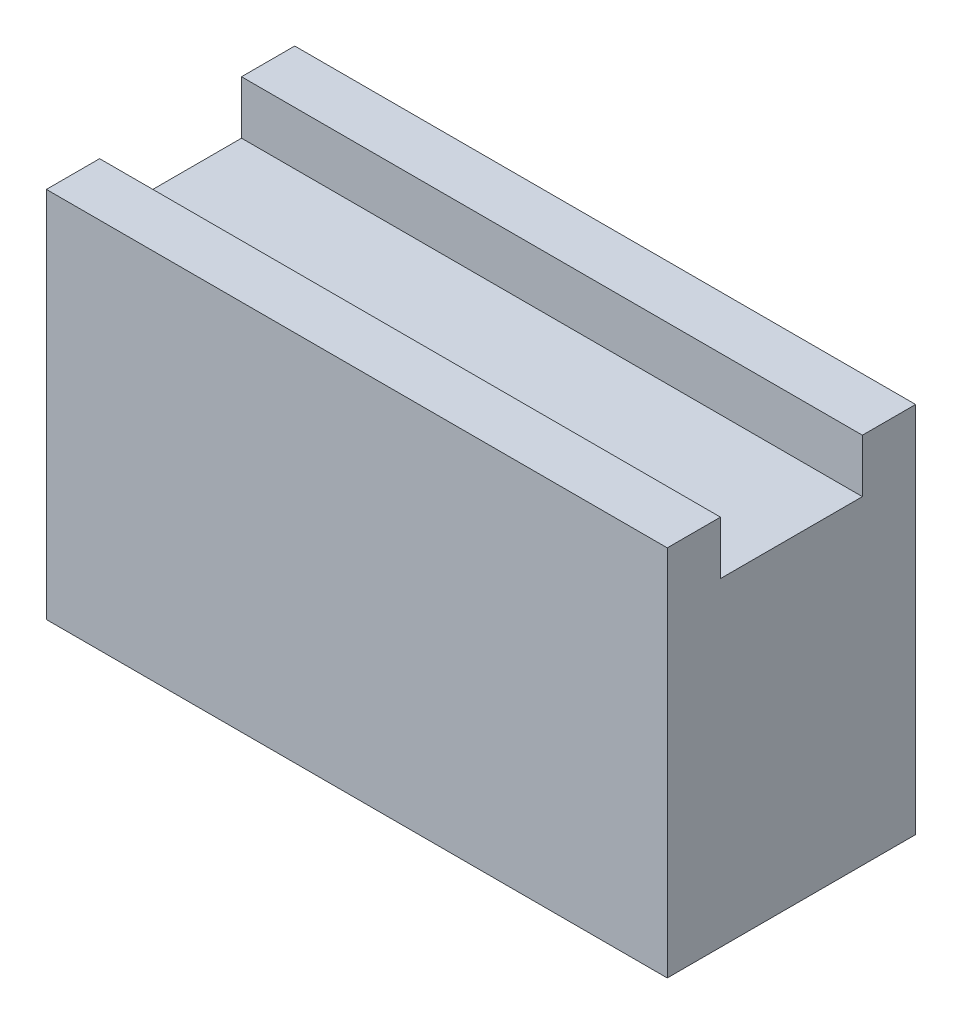
ISO-10303-21;
HEADER;
FILE_DESCRIPTION(('STEP AP214'),'2;1');
FILE_NAME('part.step','',(''),(''),'','','');
FILE_SCHEMA(('AUTOMOTIVE_DESIGN { 1 0 10303 214 1 1 1 1 }'));
ENDSEC;
DATA;
#1=APPLICATION_CONTEXT('core data for automotive mechanical design processes');
#2=APPLICATION_PROTOCOL_DEFINITION('international standard','automotive_design',2000,#1);
#3=PRODUCT_CONTEXT('',#1,'mechanical');
#4=PRODUCT('Part','Part','',(#3));
#5=PRODUCT_RELATED_PRODUCT_CATEGORY('part','',(#4));
#6=PRODUCT_DEFINITION_FORMATION('','',#4);
#7=PRODUCT_DEFINITION_CONTEXT('part definition',#1,'design');
#8=PRODUCT_DEFINITION('design','',#6,#7);
#9=PRODUCT_DEFINITION_SHAPE('','',#8);
#10=(LENGTH_UNIT() NAMED_UNIT(*) SI_UNIT(.MILLI.,.METRE.));
#11=(NAMED_UNIT(*) PLANE_ANGLE_UNIT() SI_UNIT($,.RADIAN.));
#12=(NAMED_UNIT(*) SI_UNIT($,.STERADIAN.) SOLID_ANGLE_UNIT());
#13=UNCERTAINTY_MEASURE_WITH_UNIT(LENGTH_MEASURE(1.E-05),#10,'distance_accuracy_value','');
#14=(GEOMETRIC_REPRESENTATION_CONTEXT(3) GLOBAL_UNCERTAINTY_ASSIGNED_CONTEXT((#13)) GLOBAL_UNIT_ASSIGNED_CONTEXT((#10,
#11,#12)) REPRESENTATION_CONTEXT('',''));
#15=CARTESIAN_POINT('',(0.,0.,0.));
#16=DIRECTION('',(0.,0.,1.));
#17=DIRECTION('',(1.,0.,0.));
#18=AXIS2_PLACEMENT_3D('',#15,#16,#17);
#19=CARTESIAN_POINT('',(-35.,-9.,-7.));
#20=DIRECTION('',(0.,0.,-1.));
#21=DIRECTION('',(-1.,0.,0.));
#22=AXIS2_PLACEMENT_3D('',#19,#20,#21);
#23=PLANE('',#22);
#24=DIRECTION('',(0.,1.,0.));
#25=VECTOR('',#24,1.);
#26=CARTESIAN_POINT('',(0.,-9.,-7.));
#27=LINE('',#26,#25);
#28=CARTESIAN_POINT('',(0.,-9.,-7.));
#29=VERTEX_POINT('',#28);
#30=CARTESIAN_POINT('',(0.,12.,-7.));
#31=VERTEX_POINT('',#30);
#32=EDGE_CURVE('E155',#29,#31,#27,.T.);
#33=ORIENTED_EDGE('',*,*,#32,.F.);
#34=DIRECTION('',(1.,0.,0.));
#35=VECTOR('',#34,1.);
#36=CARTESIAN_POINT('',(-35.,-9.,-7.));
#37=LINE('',#36,#35);
#38=CARTESIAN_POINT('',(-35.,-9.,-7.));
#39=VERTEX_POINT('',#38);
#40=EDGE_CURVE('E11',#39,#29,#37,.T.);
#41=ORIENTED_EDGE('',*,*,#40,.F.);
#42=DIRECTION('',(0.,1.,0.));
#43=VECTOR('',#42,1.);
#44=CARTESIAN_POINT('',(-35.,9.,-7.));
#45=LINE('',#44,#43);
#46=CARTESIAN_POINT('',(-35.,12.,-7.));
#47=VERTEX_POINT('',#46);
#48=EDGE_CURVE('E58',#39,#47,#45,.T.);
#49=ORIENTED_EDGE('',*,*,#48,.T.);
#50=DIRECTION('',(1.,0.,0.));
#51=VECTOR('',#50,1.);
#52=CARTESIAN_POINT('',(-35.,12.,-7.));
#53=LINE('',#52,#51);
#54=EDGE_CURVE('E43',#47,#31,#53,.T.);
#55=ORIENTED_EDGE('',*,*,#54,.T.);
#56=EDGE_LOOP('',(#33,#41,#49,#55));
#57=FACE_BOUND('',#56,.T.);
#58=ADVANCED_FACE('F39',(#57),#23,.T.);
#59=CARTESIAN_POINT('',(-35.,-9.,7.));
#60=DIRECTION('',(0.,-1.,0.));
#61=DIRECTION('',(0.,0.,-1.));
#62=AXIS2_PLACEMENT_3D('',#59,#60,#61);
#63=PLANE('',#62);
#64=DIRECTION('',(0.,0.,-1.));
#65=VECTOR('',#64,1.);
#66=CARTESIAN_POINT('',(0.,-9.,7.));
#67=LINE('',#66,#65);
#68=CARTESIAN_POINT('',(0.,-9.,7.));
#69=VERTEX_POINT('',#68);
#70=EDGE_CURVE('E153',#69,#29,#67,.T.);
#71=ORIENTED_EDGE('',*,*,#70,.F.);
#72=DIRECTION('',(1.,0.,0.));
#73=VECTOR('',#72,1.);
#74=CARTESIAN_POINT('',(-35.,-9.,7.));
#75=LINE('',#74,#73);
#76=CARTESIAN_POINT('',(-35.,-9.,7.));
#77=VERTEX_POINT('',#76);
#78=EDGE_CURVE('E49',#77,#69,#75,.T.);
#79=ORIENTED_EDGE('',*,*,#78,.F.);
#80=DIRECTION('',(0.,0.,-1.));
#81=VECTOR('',#80,1.);
#82=CARTESIAN_POINT('',(-35.,-9.,7.));
#83=LINE('',#82,#81);
#84=EDGE_CURVE('E128',#77,#39,#83,.T.);
#85=ORIENTED_EDGE('',*,*,#84,.T.);
#86=ORIENTED_EDGE('',*,*,#40,.T.);
#87=EDGE_LOOP('',(#71,#79,#85,#86));
#88=FACE_BOUND('',#87,.T.);
#89=ADVANCED_FACE('F168',(#88),#63,.T.);
#90=CARTESIAN_POINT('',(-35.,-9.,7.));
#91=DIRECTION('',(0.,0.,1.));
#92=DIRECTION('',(1.,0.,0.));
#93=AXIS2_PLACEMENT_3D('',#90,#91,#92);
#94=PLANE('',#93);
#95=DIRECTION('',(0.,-1.,0.));
#96=VECTOR('',#95,1.);
#97=CARTESIAN_POINT('',(0.,-9.,7.));
#98=LINE('',#97,#96);
#99=CARTESIAN_POINT('',(0.,12.,7.));
#100=VERTEX_POINT('',#99);
#101=EDGE_CURVE('E116',#100,#69,#98,.T.);
#102=ORIENTED_EDGE('',*,*,#101,.F.);
#103=DIRECTION('',(1.,0.,0.));
#104=VECTOR('',#103,1.);
#105=CARTESIAN_POINT('',(-35.,12.,7.));
#106=LINE('',#105,#104);
#107=CARTESIAN_POINT('',(-35.,12.,7.));
#108=VERTEX_POINT('',#107);
#109=EDGE_CURVE('E111',#108,#100,#106,.T.);
#110=ORIENTED_EDGE('',*,*,#109,.F.);
#111=DIRECTION('',(0.,-1.,0.));
#112=VECTOR('',#111,1.);
#113=CARTESIAN_POINT('',(-35.,9.,7.));
#114=LINE('',#113,#112);
#115=EDGE_CURVE('E114',#108,#77,#114,.T.);
#116=ORIENTED_EDGE('',*,*,#115,.T.);
#117=ORIENTED_EDGE('',*,*,#78,.T.);
#118=EDGE_LOOP('',(#102,#110,#116,#117));
#119=FACE_BOUND('',#118,.T.);
#120=ADVANCED_FACE('F113',(#119),#94,.T.);
#121=CARTESIAN_POINT('',(-35.,12.,7.));
#122=DIRECTION('',(0.,1.,0.));
#123=DIRECTION('',(0.,0.,1.));
#124=AXIS2_PLACEMENT_3D('',#121,#122,#123);
#125=PLANE('',#124);
#126=DIRECTION('',(0.,0.,1.));
#127=VECTOR('',#126,1.);
#128=CARTESIAN_POINT('',(0.,12.,7.));
#129=LINE('',#128,#127);
#130=CARTESIAN_POINT('',(0.,12.,4.));
#131=VERTEX_POINT('',#130);
#132=EDGE_CURVE('E150',#131,#100,#129,.T.);
#133=ORIENTED_EDGE('',*,*,#132,.F.);
#134=DIRECTION('',(1.,0.,0.));
#135=VECTOR('',#134,1.);
#136=CARTESIAN_POINT('',(-35.,12.,4.));
#137=LINE('',#136,#135);
#138=CARTESIAN_POINT('',(-35.,12.,4.));
#139=VERTEX_POINT('',#138);
#140=EDGE_CURVE('E121',#139,#131,#137,.T.);
#141=ORIENTED_EDGE('',*,*,#140,.F.);
#142=DIRECTION('',(0.,0.,1.));
#143=VECTOR('',#142,1.);
#144=CARTESIAN_POINT('',(-35.,12.,7.));
#145=LINE('',#144,#143);
#146=EDGE_CURVE('E126',#139,#108,#145,.T.);
#147=ORIENTED_EDGE('',*,*,#146,.T.);
#148=ORIENTED_EDGE('',*,*,#109,.T.);
#149=EDGE_LOOP('',(#133,#141,#147,#148));
#150=FACE_BOUND('',#149,.T.);
#151=ADVANCED_FACE('F130',(#150),#125,.T.);
#152=CARTESIAN_POINT('',(-35.,12.,4.));
#153=DIRECTION('',(0.,0.,-1.));
#154=DIRECTION('',(0.,1.,0.));
#155=AXIS2_PLACEMENT_3D('',#152,#153,#154);
#156=PLANE('',#155);
#157=DIRECTION('',(0.,1.,0.));
#158=VECTOR('',#157,1.);
#159=CARTESIAN_POINT('',(0.,12.,4.));
#160=LINE('',#159,#158);
#161=CARTESIAN_POINT('',(0.,9.,4.));
#162=VERTEX_POINT('',#161);
#163=EDGE_CURVE('E147',#162,#131,#160,.T.);
#164=ORIENTED_EDGE('',*,*,#163,.F.);
#165=DIRECTION('',(1.,0.,0.));
#166=VECTOR('',#165,1.);
#167=CARTESIAN_POINT('',(-35.,9.,4.));
#168=LINE('',#167,#166);
#169=CARTESIAN_POINT('',(-35.,9.,4.));
#170=VERTEX_POINT('',#169);
#171=EDGE_CURVE('E159',#170,#162,#168,.T.);
#172=ORIENTED_EDGE('',*,*,#171,.F.);
#173=DIRECTION('',(0.,1.,0.));
#174=VECTOR('',#173,1.);
#175=CARTESIAN_POINT('',(-35.,12.,4.));
#176=LINE('',#175,#174);
#177=EDGE_CURVE('E131',#170,#139,#176,.T.);
#178=ORIENTED_EDGE('',*,*,#177,.T.);
#179=ORIENTED_EDGE('',*,*,#140,.T.);
#180=EDGE_LOOP('',(#164,#172,#178,#179));
#181=FACE_BOUND('',#180,.T.);
#182=ADVANCED_FACE('F181',(#181),#156,.T.);
#183=CARTESIAN_POINT('',(-35.,9.,4.));
#184=DIRECTION('',(0.,1.,0.));
#185=DIRECTION('',(0.,0.,1.));
#186=AXIS2_PLACEMENT_3D('',#183,#184,#185);
#187=PLANE('',#186);
#188=DIRECTION('',(0.,0.,1.));
#189=VECTOR('',#188,1.);
#190=CARTESIAN_POINT('',(0.,9.,4.));
#191=LINE('',#190,#189);
#192=CARTESIAN_POINT('',(0.,9.,-4.));
#193=VERTEX_POINT('',#192);
#194=EDGE_CURVE('E144',#193,#162,#191,.T.);
#195=ORIENTED_EDGE('',*,*,#194,.F.);
#196=DIRECTION('',(1.,0.,0.));
#197=VECTOR('',#196,1.);
#198=CARTESIAN_POINT('',(-35.,9.,-4.));
#199=LINE('',#198,#197);
#200=CARTESIAN_POINT('',(-35.,9.,-4.));
#201=VERTEX_POINT('',#200);
#202=EDGE_CURVE('E161',#201,#193,#199,.T.);
#203=ORIENTED_EDGE('',*,*,#202,.F.);
#204=DIRECTION('',(0.,0.,1.));
#205=VECTOR('',#204,1.);
#206=CARTESIAN_POINT('',(-35.,9.,4.));
#207=LINE('',#206,#205);
#208=EDGE_CURVE('E133',#201,#170,#207,.T.);
#209=ORIENTED_EDGE('',*,*,#208,.T.);
#210=ORIENTED_EDGE('',*,*,#171,.T.);
#211=EDGE_LOOP('',(#195,#203,#209,#210));
#212=FACE_BOUND('',#211,.T.);
#213=ADVANCED_FACE('F184',(#212),#187,.T.);
#214=CARTESIAN_POINT('',(-35.,12.,-4.));
#215=DIRECTION('',(0.,0.,1.));
#216=DIRECTION('',(0.,-1.,0.));
#217=AXIS2_PLACEMENT_3D('',#214,#215,#216);
#218=PLANE('',#217);
#219=DIRECTION('',(0.,-1.,0.));
#220=VECTOR('',#219,1.);
#221=CARTESIAN_POINT('',(0.,12.,-4.));
#222=LINE('',#221,#220);
#223=CARTESIAN_POINT('',(0.,12.,-4.));
#224=VERTEX_POINT('',#223);
#225=EDGE_CURVE('E141',#224,#193,#222,.T.);
#226=ORIENTED_EDGE('',*,*,#225,.F.);
#227=DIRECTION('',(1.,0.,0.));
#228=VECTOR('',#227,1.);
#229=CARTESIAN_POINT('',(-35.,12.,-4.));
#230=LINE('',#229,#228);
#231=CARTESIAN_POINT('',(-35.,12.,-4.));
#232=VERTEX_POINT('',#231);
#233=EDGE_CURVE('E162',#232,#224,#230,.T.);
#234=ORIENTED_EDGE('',*,*,#233,.F.);
#235=DIRECTION('',(0.,-1.,0.));
#236=VECTOR('',#235,1.);
#237=CARTESIAN_POINT('',(-35.,12.,-4.));
#238=LINE('',#237,#236);
#239=EDGE_CURVE('E197',#232,#201,#238,.T.);
#240=ORIENTED_EDGE('',*,*,#239,.T.);
#241=ORIENTED_EDGE('',*,*,#202,.T.);
#242=EDGE_LOOP('',(#226,#234,#240,#241));
#243=FACE_BOUND('',#242,.T.);
#244=ADVANCED_FACE('F187',(#243),#218,.T.);
#245=CARTESIAN_POINT('',(-35.,12.,-7.));
#246=DIRECTION('',(0.,1.,0.));
#247=DIRECTION('',(0.,0.,1.));
#248=AXIS2_PLACEMENT_3D('',#245,#246,#247);
#249=PLANE('',#248);
#250=DIRECTION('',(0.,0.,1.));
#251=VECTOR('',#250,1.);
#252=CARTESIAN_POINT('',(0.,12.,-7.));
#253=LINE('',#252,#251);
#254=EDGE_CURVE('E138',#31,#224,#253,.T.);
#255=ORIENTED_EDGE('',*,*,#254,.F.);
#256=ORIENTED_EDGE('',*,*,#54,.F.);
#257=DIRECTION('',(0.,0.,1.));
#258=VECTOR('',#257,1.);
#259=CARTESIAN_POINT('',(-35.,12.,-7.));
#260=LINE('',#259,#258);
#261=EDGE_CURVE('E201',#47,#232,#260,.T.);
#262=ORIENTED_EDGE('',*,*,#261,.T.);
#263=ORIENTED_EDGE('',*,*,#233,.T.);
#264=EDGE_LOOP('',(#255,#256,#262,#263));
#265=FACE_BOUND('',#264,.T.);
#266=ADVANCED_FACE('F41',(#265),#249,.T.);
#267=CARTESIAN_POINT('',(-35.,0.,0.));
#268=DIRECTION('',(1.,0.,0.));
#269=DIRECTION('',(0.,0.,-1.));
#270=AXIS2_PLACEMENT_3D('',#267,#268,#269);
#271=PLANE('',#270);
#272=ORIENTED_EDGE('',*,*,#48,.F.);
#273=ORIENTED_EDGE('',*,*,#84,.F.);
#274=ORIENTED_EDGE('',*,*,#115,.F.);
#275=ORIENTED_EDGE('',*,*,#146,.F.);
#276=ORIENTED_EDGE('',*,*,#177,.F.);
#277=ORIENTED_EDGE('',*,*,#208,.F.);
#278=ORIENTED_EDGE('',*,*,#239,.F.);
#279=ORIENTED_EDGE('',*,*,#261,.F.);
#280=EDGE_LOOP('',(#272,#273,#274,#275,#276,#277,#278,#279));
#281=FACE_BOUND('',#280,.T.);
#282=ADVANCED_FACE('F124',(#281),#271,.F.);
#283=CARTESIAN_POINT('',(0.,0.,0.));
#284=DIRECTION('',(1.,0.,0.));
#285=DIRECTION('',(0.,0.,-1.));
#286=AXIS2_PLACEMENT_3D('',#283,#284,#285);
#287=PLANE('',#286);
#288=ORIENTED_EDGE('',*,*,#32,.T.);
#289=ORIENTED_EDGE('',*,*,#254,.T.);
#290=ORIENTED_EDGE('',*,*,#225,.T.);
#291=ORIENTED_EDGE('',*,*,#194,.T.);
#292=ORIENTED_EDGE('',*,*,#163,.T.);
#293=ORIENTED_EDGE('',*,*,#132,.T.);
#294=ORIENTED_EDGE('',*,*,#101,.T.);
#295=ORIENTED_EDGE('',*,*,#70,.T.);
#296=EDGE_LOOP('',(#288,#289,#290,#291,#292,#293,#294,#295));
#297=FACE_BOUND('',#296,.T.);
#298=ADVANCED_FACE('F167',(#297),#287,.T.);
#299=CLOSED_SHELL('',(#58,#89,#120,#151,#182,#213,#244,#266,#282,#298));
#300=MANIFOLD_SOLID_BREP('B2',#299);
#301=ADVANCED_BREP_SHAPE_REPRESENTATION('',(#18,#300),#14);
#302=SHAPE_DEFINITION_REPRESENTATION(#9,#301);
ENDSEC;
END-ISO-10303-21;
